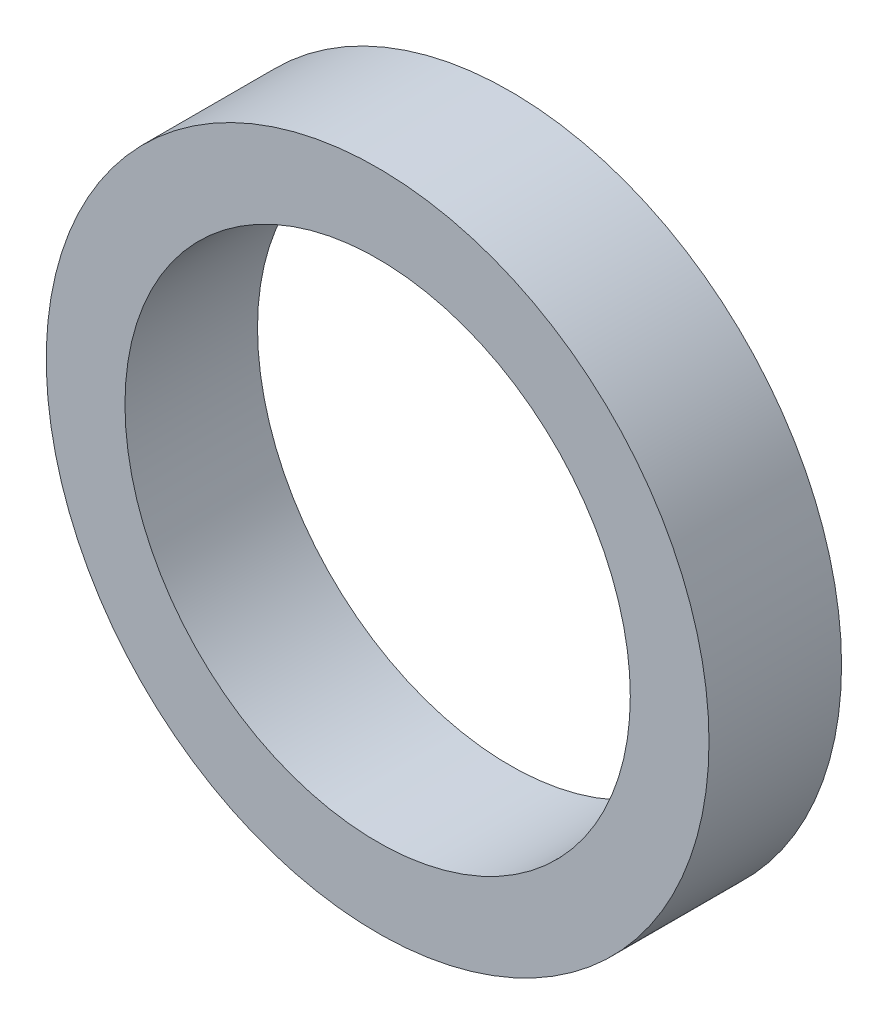
ISO-10303-21;
HEADER;
FILE_DESCRIPTION(('STEP AP214'),'2;1');
FILE_NAME('part.step','',(''),(''),'','','');
FILE_SCHEMA(('AUTOMOTIVE_DESIGN { 1 0 10303 214 1 1 1 1 }'));
ENDSEC;
DATA;
#1=APPLICATION_CONTEXT('core data for automotive mechanical design processes');
#2=APPLICATION_PROTOCOL_DEFINITION('international standard','automotive_design',2000,#1);
#3=PRODUCT_CONTEXT('',#1,'mechanical');
#4=PRODUCT('Part','Part','',(#3));
#5=PRODUCT_RELATED_PRODUCT_CATEGORY('part','',(#4));
#6=PRODUCT_DEFINITION_FORMATION('','',#4);
#7=PRODUCT_DEFINITION_CONTEXT('part definition',#1,'design');
#8=PRODUCT_DEFINITION('design','',#6,#7);
#9=PRODUCT_DEFINITION_SHAPE('','',#8);
#10=(LENGTH_UNIT() NAMED_UNIT(*) SI_UNIT(.MILLI.,.METRE.));
#11=(NAMED_UNIT(*) PLANE_ANGLE_UNIT() SI_UNIT($,.RADIAN.));
#12=(NAMED_UNIT(*) SI_UNIT($,.STERADIAN.) SOLID_ANGLE_UNIT());
#13=UNCERTAINTY_MEASURE_WITH_UNIT(LENGTH_MEASURE(1.E-05),#10,'distance_accuracy_value','');
#14=(GEOMETRIC_REPRESENTATION_CONTEXT(3) GLOBAL_UNCERTAINTY_ASSIGNED_CONTEXT((#13)) GLOBAL_UNIT_ASSIGNED_CONTEXT((#10,
#11,#12)) REPRESENTATION_CONTEXT('',''));
#15=CARTESIAN_POINT('',(0.,0.,0.));
#16=DIRECTION('',(0.,0.,1.));
#17=DIRECTION('',(1.,0.,0.));
#18=AXIS2_PLACEMENT_3D('',#15,#16,#17);
#19=CARTESIAN_POINT('',(0.,0.,1.8));
#20=DIRECTION('',(0.,0.,1.));
#21=DIRECTION('',(1.,0.,0.));
#22=AXIS2_PLACEMENT_3D('',#19,#20,#21);
#23=PLANE('',#22);
#24=CARTESIAN_POINT('',(0.,0.,1.8));
#25=DIRECTION('',(0.,0.,1.));
#26=DIRECTION('',(1.,0.,0.));
#27=AXIS2_PLACEMENT_3D('',#24,#25,#26);
#28=CIRCLE('',#27,2.);
#29=CARTESIAN_POINT('',(2.,0.,1.8));
#30=VERTEX_POINT('',#29);
#31=EDGE_CURVE('E10',#30,#30,#28,.T.);
#32=ORIENTED_EDGE('',*,*,#31,.T.);
#33=EDGE_LOOP('',(#32));
#34=FACE_BOUND('',#33,.T.);
#35=CARTESIAN_POINT('',(0.,0.,1.8));
#36=DIRECTION('',(0.,0.,1.));
#37=DIRECTION('',(1.,0.,0.));
#38=AXIS2_PLACEMENT_3D('',#35,#36,#37);
#39=CIRCLE('',#38,1.525);
#40=CARTESIAN_POINT('',(1.525,0.,1.8));
#41=VERTEX_POINT('',#40);
#42=EDGE_CURVE('E49',#41,#41,#39,.T.);
#43=ORIENTED_EDGE('',*,*,#42,.F.);
#44=EDGE_LOOP('',(#43));
#45=FACE_BOUND('',#44,.T.);
#46=ADVANCED_FACE('F39',(#34,#45),#23,.T.);
#47=CARTESIAN_POINT('',(0.,0.,1.));
#48=DIRECTION('',(0.,0.,1.));
#49=DIRECTION('',(1.,0.,0.));
#50=AXIS2_PLACEMENT_3D('',#47,#48,#49);
#51=PLANE('',#50);
#52=CARTESIAN_POINT('',(0.,0.,1.));
#53=DIRECTION('',(0.,0.,1.));
#54=DIRECTION('',(1.,0.,0.));
#55=AXIS2_PLACEMENT_3D('',#52,#53,#54);
#56=CIRCLE('',#55,2.);
#57=CARTESIAN_POINT('',(2.,0.,1.));
#58=VERTEX_POINT('',#57);
#59=EDGE_CURVE('E43',#58,#58,#56,.T.);
#60=ORIENTED_EDGE('',*,*,#59,.F.);
#61=EDGE_LOOP('',(#60));
#62=FACE_BOUND('',#61,.T.);
#63=CARTESIAN_POINT('',(0.,0.,1.));
#64=DIRECTION('',(0.,0.,1.));
#65=DIRECTION('',(1.,0.,0.));
#66=AXIS2_PLACEMENT_3D('',#63,#64,#65);
#67=CIRCLE('',#66,1.525);
#68=CARTESIAN_POINT('',(1.525,0.,1.));
#69=VERTEX_POINT('',#68);
#70=EDGE_CURVE('E55',#69,#69,#67,.T.);
#71=ORIENTED_EDGE('',*,*,#70,.T.);
#72=EDGE_LOOP('',(#71));
#73=FACE_BOUND('',#72,.T.);
#74=ADVANCED_FACE('F62',(#62,#73),#51,.F.);
#75=CARTESIAN_POINT('',(0.,0.,1.8));
#76=DIRECTION('',(0.,0.,-1.));
#77=DIRECTION('',(-1.,0.,0.));
#78=AXIS2_PLACEMENT_3D('',#75,#76,#77);
#79=CYLINDRICAL_SURFACE('',#78,2.);
#80=ORIENTED_EDGE('',*,*,#31,.F.);
#81=EDGE_LOOP('',(#80));
#82=FACE_BOUND('',#81,.T.);
#83=ORIENTED_EDGE('',*,*,#59,.T.);
#84=EDGE_LOOP('',(#83));
#85=FACE_BOUND('',#84,.T.);
#86=ADVANCED_FACE('F41',(#82,#85),#79,.T.);
#87=CARTESIAN_POINT('',(0.,0.,1.8));
#88=DIRECTION('',(0.,0.,-1.));
#89=DIRECTION('',(-1.,0.,0.));
#90=AXIS2_PLACEMENT_3D('',#87,#88,#89);
#91=CYLINDRICAL_SURFACE('',#90,1.525);
#92=ORIENTED_EDGE('',*,*,#42,.T.);
#93=EDGE_LOOP('',(#92));
#94=FACE_BOUND('',#93,.T.);
#95=ORIENTED_EDGE('',*,*,#70,.F.);
#96=EDGE_LOOP('',(#95));
#97=FACE_BOUND('',#96,.T.);
#98=ADVANCED_FACE('F59',(#94,#97),#91,.F.);
#99=CLOSED_SHELL('',(#46,#74,#86,#98));
#100=MANIFOLD_SOLID_BREP('B2',#99);
#101=ADVANCED_BREP_SHAPE_REPRESENTATION('',(#18,#100),#14);
#102=SHAPE_DEFINITION_REPRESENTATION(#9,#101);
ENDSEC;
END-ISO-10303-21;
